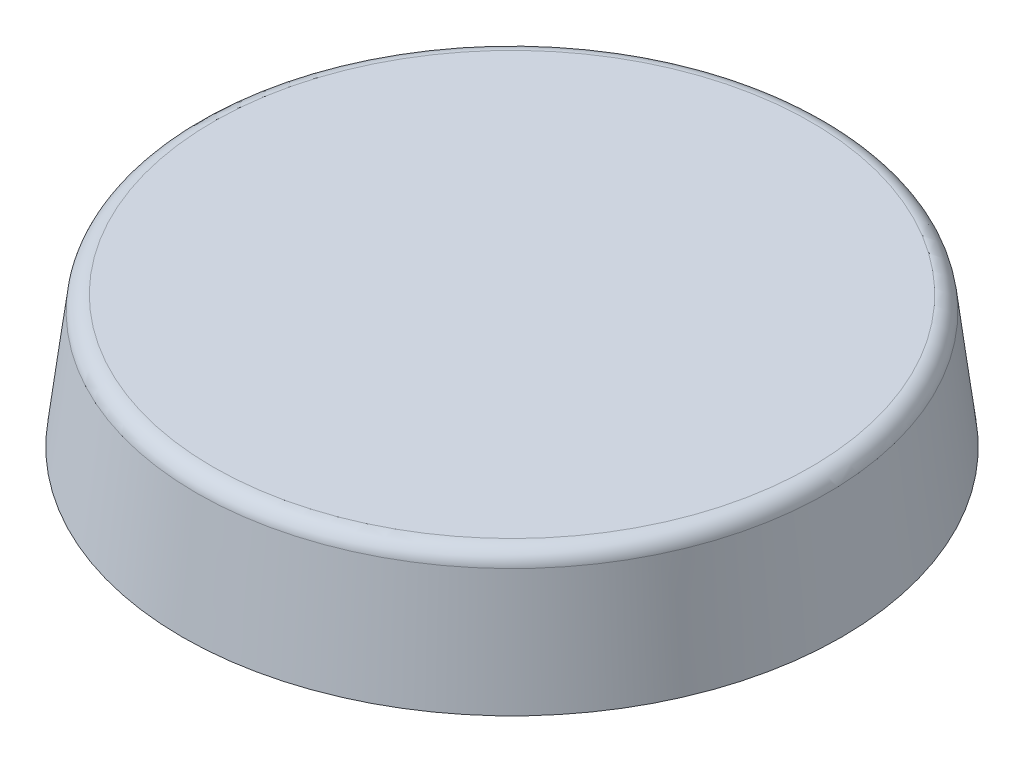
ISO-10303-21;
HEADER;
FILE_DESCRIPTION(('STEP AP214'),'2;1');
FILE_NAME('part.step','',(''),(''),'','','');
FILE_SCHEMA(('AUTOMOTIVE_DESIGN { 1 0 10303 214 1 1 1 1 }'));
ENDSEC;
DATA;
#1=APPLICATION_CONTEXT('core data for automotive mechanical design processes');
#2=APPLICATION_PROTOCOL_DEFINITION('international standard','automotive_design',2000,#1);
#3=PRODUCT_CONTEXT('',#1,'mechanical');
#4=PRODUCT('Part','Part','',(#3));
#5=PRODUCT_RELATED_PRODUCT_CATEGORY('part','',(#4));
#6=PRODUCT_DEFINITION_FORMATION('','',#4);
#7=PRODUCT_DEFINITION_CONTEXT('part definition',#1,'design');
#8=PRODUCT_DEFINITION('design','',#6,#7);
#9=PRODUCT_DEFINITION_SHAPE('','',#8);
#10=(LENGTH_UNIT() NAMED_UNIT(*) SI_UNIT(.MILLI.,.METRE.));
#11=(NAMED_UNIT(*) PLANE_ANGLE_UNIT() SI_UNIT($,.RADIAN.));
#12=(NAMED_UNIT(*) SI_UNIT($,.STERADIAN.) SOLID_ANGLE_UNIT());
#13=UNCERTAINTY_MEASURE_WITH_UNIT(LENGTH_MEASURE(1.E-05),#10,'distance_accuracy_value','');
#14=(GEOMETRIC_REPRESENTATION_CONTEXT(3) GLOBAL_UNCERTAINTY_ASSIGNED_CONTEXT((#13)) GLOBAL_UNIT_ASSIGNED_CONTEXT((#10,
#11,#12)) REPRESENTATION_CONTEXT('',''));
#15=CARTESIAN_POINT('',(0.,0.,0.));
#16=DIRECTION('',(0.,0.,1.));
#17=DIRECTION('',(1.,0.,0.));
#18=AXIS2_PLACEMENT_3D('',#15,#16,#17);
#19=CARTESIAN_POINT('',(0.,0.,0.));
#20=DIRECTION('',(0.,-1.,0.));
#21=DIRECTION('',(0.,0.,1.));
#22=AXIS2_PLACEMENT_3D('',#19,#20,#21);
#23=CONICAL_SURFACE('',#22,10.,0.122173047639603);
#24=CARTESIAN_POINT('',(0.,3.56093467170257,0.));
#25=DIRECTION('',(0.,-1.,0.));
#26=DIRECTION('',(0.,0.,-1.));
#27=AXIS2_PLACEMENT_3D('',#24,#25,#26);
#28=CIRCLE('',#27,9.56277219993107);
#29=CARTESIAN_POINT('',(0.,3.56093467170257,-9.56277219993107));
#30=VERTEX_POINT('',#29);
#31=EDGE_CURVE('E10',#30,#30,#28,.T.);
#32=ORIENTED_EDGE('',*,*,#31,.T.);
#33=EDGE_LOOP('',(#32));
#34=FACE_BOUND('',#33,.T.);
#35=CARTESIAN_POINT('',(0.,0.,0.));
#36=DIRECTION('',(0.,1.,0.));
#37=DIRECTION('',(0.,0.,1.));
#38=AXIS2_PLACEMENT_3D('',#35,#36,#37);
#39=CIRCLE('',#38,10.);
#40=CARTESIAN_POINT('',(0.,0.,10.));
#41=VERTEX_POINT('',#40);
#42=EDGE_CURVE('E42',#41,#41,#39,.T.);
#43=ORIENTED_EDGE('',*,*,#42,.T.);
#44=EDGE_LOOP('',(#43));
#45=FACE_BOUND('',#44,.T.);
#46=ADVANCED_FACE('F31',(#34,#45),#23,.T.);
#47=CARTESIAN_POINT('',(0.,4.,0.));
#48=DIRECTION('',(0.,1.,0.));
#49=DIRECTION('',(0.,0.,1.));
#50=AXIS2_PLACEMENT_3D('',#47,#48,#49);
#51=PLANE('',#50);
#52=CARTESIAN_POINT('',(0.,4.,0.));
#53=DIRECTION('',(0.,1.,0.));
#54=DIRECTION('',(0.,0.,1.));
#55=AXIS2_PLACEMENT_3D('',#52,#53,#54);
#56=CIRCLE('',#55,9.06649912411041);
#57=CARTESIAN_POINT('',(0.,4.,9.06649912411041));
#58=VERTEX_POINT('',#57);
#59=EDGE_CURVE('E38',#58,#58,#56,.T.);
#60=ORIENTED_EDGE('',*,*,#59,.T.);
#61=EDGE_LOOP('',(#60));
#62=FACE_BOUND('',#61,.T.);
#63=ADVANCED_FACE('F52',(#62),#51,.T.);
#64=CARTESIAN_POINT('',(0.,0.,0.));
#65=DIRECTION('',(0.,1.,0.));
#66=DIRECTION('',(0.,0.,1.));
#67=AXIS2_PLACEMENT_3D('',#64,#65,#66);
#68=PLANE('',#67);
#69=ORIENTED_EDGE('',*,*,#42,.F.);
#70=EDGE_LOOP('',(#69));
#71=FACE_BOUND('',#70,.T.);
#72=ADVANCED_FACE('F50',(#71),#68,.F.);
#73=CARTESIAN_POINT('',(0.,3.5,0.));
#74=DIRECTION('',(0.,1.,0.));
#75=DIRECTION('',(0.,0.,1.));
#76=AXIS2_PLACEMENT_3D('',#73,#74,#75);
#77=TOROIDAL_SURFACE('',#76,9.06649912411041,0.5);
#78=ORIENTED_EDGE('',*,*,#31,.F.);
#79=EDGE_LOOP('',(#78));
#80=FACE_BOUND('',#79,.T.);
#81=ORIENTED_EDGE('',*,*,#59,.F.);
#82=EDGE_LOOP('',(#81));
#83=FACE_BOUND('',#82,.T.);
#84=ADVANCED_FACE('F33',(#80,#83),#77,.T.);
#85=CLOSED_SHELL('',(#46,#63,#72,#84));
#86=MANIFOLD_SOLID_BREP('B2',#85);
#87=ADVANCED_BREP_SHAPE_REPRESENTATION('',(#18,#86),#14);
#88=SHAPE_DEFINITION_REPRESENTATION(#9,#87);
ENDSEC;
END-ISO-10303-21;
